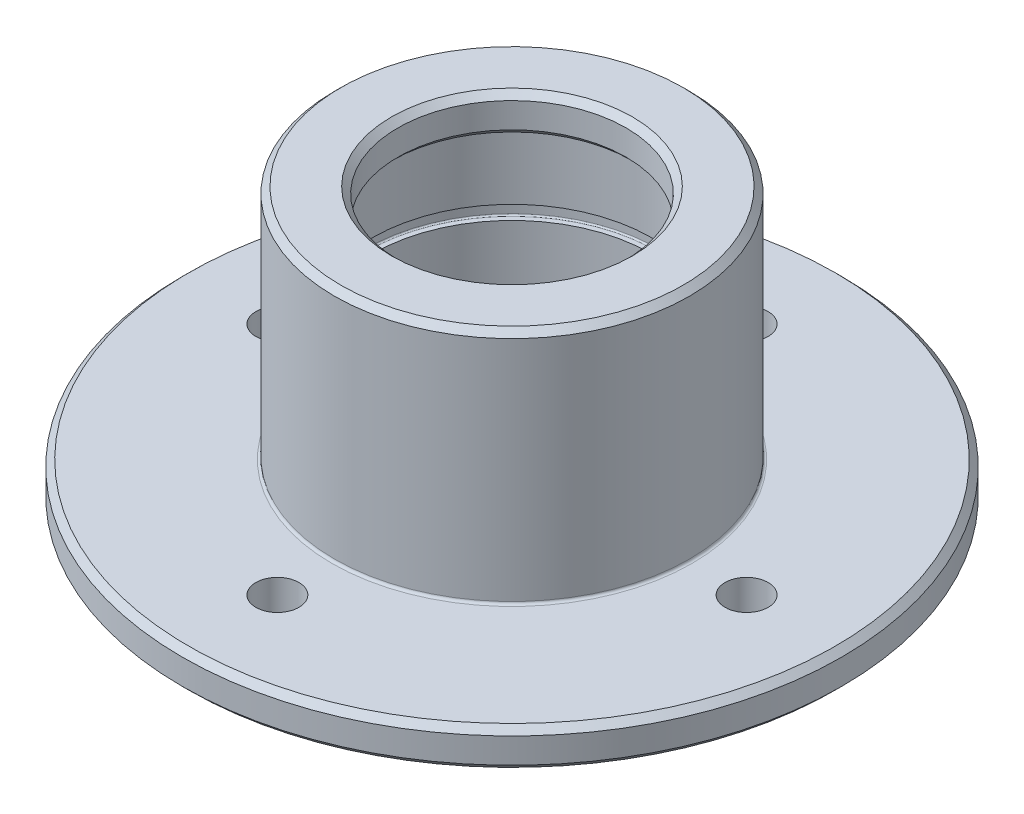
ISO-10303-21;
HEADER;
FILE_DESCRIPTION(('STEP AP214'),'2;1');
FILE_NAME('part.step','',(''),(''),'','','');
FILE_SCHEMA(('AUTOMOTIVE_DESIGN { 1 0 10303 214 1 1 1 1 }'));
ENDSEC;
DATA;
#1=APPLICATION_CONTEXT('core data for automotive mechanical design processes');
#2=APPLICATION_PROTOCOL_DEFINITION('international standard','automotive_design',2000,#1);
#3=PRODUCT_CONTEXT('',#1,'mechanical');
#4=PRODUCT('Part','Part','',(#3));
#5=PRODUCT_RELATED_PRODUCT_CATEGORY('part','',(#4));
#6=PRODUCT_DEFINITION_FORMATION('','',#4);
#7=PRODUCT_DEFINITION_CONTEXT('part definition',#1,'design');
#8=PRODUCT_DEFINITION('design','',#6,#7);
#9=PRODUCT_DEFINITION_SHAPE('','',#8);
#10=(LENGTH_UNIT() NAMED_UNIT(*) SI_UNIT(.MILLI.,.METRE.));
#11=(NAMED_UNIT(*) PLANE_ANGLE_UNIT() SI_UNIT($,.RADIAN.));
#12=(NAMED_UNIT(*) SI_UNIT($,.STERADIAN.) SOLID_ANGLE_UNIT());
#13=UNCERTAINTY_MEASURE_WITH_UNIT(LENGTH_MEASURE(1.E-05),#10,'distance_accuracy_value','');
#14=(GEOMETRIC_REPRESENTATION_CONTEXT(3) GLOBAL_UNCERTAINTY_ASSIGNED_CONTEXT((#13)) GLOBAL_UNIT_ASSIGNED_CONTEXT((#10,
#11,#12)) REPRESENTATION_CONTEXT('',''));
#15=CARTESIAN_POINT('',(0.,0.,0.));
#16=DIRECTION('',(0.,0.,1.));
#17=DIRECTION('',(1.,0.,0.));
#18=AXIS2_PLACEMENT_3D('',#15,#16,#17);
#19=CARTESIAN_POINT('',(0.,17.9540192467724,0.));
#20=DIRECTION('',(0.,1.,0.));
#21=DIRECTION('',(0.,0.,1.));
#22=AXIS2_PLACEMENT_3D('',#19,#20,#21);
#23=CYLINDRICAL_SURFACE('',#22,11.);
#24=CARTESIAN_POINT('',(0.,-2.5,0.));
#25=DIRECTION('',(0.,1.,0.));
#26=DIRECTION('',(0.,0.,1.));
#27=AXIS2_PLACEMENT_3D('',#24,#25,#26);
#28=CIRCLE('',#27,11.);
#29=CARTESIAN_POINT('',(0.,-2.5,11.));
#30=VERTEX_POINT('',#29);
#31=EDGE_CURVE('E68',#30,#30,#28,.F.);
#32=ORIENTED_EDGE('',*,*,#31,.T.);
#33=EDGE_LOOP('',(#32));
#34=FACE_BOUND('',#33,.T.);
#35=CARTESIAN_POINT('',(0.,8.55000000000001,0.));
#36=DIRECTION('',(0.,1.,0.));
#37=DIRECTION('',(0.,0.,1.));
#38=AXIS2_PLACEMENT_3D('',#35,#36,#37);
#39=CIRCLE('',#38,11.);
#40=CARTESIAN_POINT('',(0.,8.55000000000003,11.));
#41=VERTEX_POINT('',#40);
#42=EDGE_CURVE('E89',#41,#41,#39,.F.);
#43=ORIENTED_EDGE('',*,*,#42,.F.);
#44=EDGE_LOOP('',(#43));
#45=FACE_BOUND('',#44,.T.);
#46=ADVANCED_FACE('F33',(#34,#45),#23,.F.);
#47=CARTESIAN_POINT('',(0.,15.45,0.));
#48=DIRECTION('',(0.,1.,0.));
#49=DIRECTION('',(0.,0.,1.));
#50=AXIS2_PLACEMENT_3D('',#47,#48,#49);
#51=CIRCLE('',#50,11.);
#52=CARTESIAN_POINT('',(0.,15.45,11.));
#53=VERTEX_POINT('',#52);
#54=EDGE_CURVE('E86',#53,#53,#51,.T.);
#55=ORIENTED_EDGE('',*,*,#54,.T.);
#56=EDGE_LOOP('',(#55));
#57=FACE_BOUND('',#56,.T.);
#58=CARTESIAN_POINT('',(0.,9.65,0.));
#59=DIRECTION('',(0.,-1.,0.));
#60=DIRECTION('',(0.,0.,-1.));
#61=AXIS2_PLACEMENT_3D('',#58,#59,#60);
#62=CIRCLE('',#61,11.);
#63=CARTESIAN_POINT('',(0.,9.64999999999998,-11.));
#64=VERTEX_POINT('',#63);
#65=EDGE_CURVE('E92',#64,#64,#62,.F.);
#66=ORIENTED_EDGE('',*,*,#65,.F.);
#67=EDGE_LOOP('',(#66));
#68=FACE_BOUND('',#67,.T.);
#69=ADVANCED_FACE('F165',(#57,#68),#23,.F.);
#70=CARTESIAN_POINT('',(0.,17.9540192467724,0.));
#71=DIRECTION('',(0.,1.,0.));
#72=DIRECTION('',(0.,0.,1.));
#73=AXIS2_PLACEMENT_3D('',#70,#71,#72);
#74=CYLINDRICAL_SURFACE('',#73,9.);
#75=CARTESIAN_POINT('',(0.,18.15,0.));
#76=DIRECTION('',(0.,-1.,0.));
#77=DIRECTION('',(0.,0.,-1.));
#78=AXIS2_PLACEMENT_3D('',#75,#76,#77);
#79=CIRCLE('',#78,9.);
#80=CARTESIAN_POINT('',(0.,18.15,-9.));
#81=VERTEX_POINT('',#80);
#82=EDGE_CURVE('E53',#81,#81,#79,.F.);
#83=ORIENTED_EDGE('',*,*,#82,.T.);
#84=EDGE_LOOP('',(#83));
#85=FACE_BOUND('',#84,.T.);
#86=CARTESIAN_POINT('',(0.,16.15,0.));
#87=DIRECTION('',(0.,1.,0.));
#88=DIRECTION('',(0.,0.,1.));
#89=AXIS2_PLACEMENT_3D('',#86,#87,#88);
#90=CIRCLE('',#89,9.);
#91=CARTESIAN_POINT('',(0.,16.15,9.));
#92=VERTEX_POINT('',#91);
#93=EDGE_CURVE('E56',#92,#92,#90,.F.);
#94=ORIENTED_EDGE('',*,*,#93,.T.);
#95=EDGE_LOOP('',(#94));
#96=FACE_BOUND('',#95,.T.);
#97=ADVANCED_FACE('F171',(#85,#96),#74,.F.);
#98=CARTESIAN_POINT('',(9.,15.65,0.));
#99=DIRECTION('',(0.,1.,0.));
#100=DIRECTION('',(0.,0.,1.));
#101=AXIS2_PLACEMENT_3D('',#98,#99,#100);
#102=PLANE('',#101);
#103=CARTESIAN_POINT('',(0.,15.65,0.));
#104=DIRECTION('',(0.,1.,0.));
#105=DIRECTION('',(0.,0.,1.));
#106=AXIS2_PLACEMENT_3D('',#103,#104,#105);
#107=CIRCLE('',#106,9.49999999999999);
#108=CARTESIAN_POINT('',(0.,15.65,9.49999999999999));
#109=VERTEX_POINT('',#108);
#110=EDGE_CURVE('E48',#109,#109,#107,.T.);
#111=ORIENTED_EDGE('',*,*,#110,.T.);
#112=EDGE_LOOP('',(#111));
#113=FACE_BOUND('',#112,.T.);
#114=CARTESIAN_POINT('',(0.,15.65,0.));
#115=DIRECTION('',(0.,1.,0.));
#116=DIRECTION('',(0.,0.,1.));
#117=AXIS2_PLACEMENT_3D('',#114,#115,#116);
#118=CIRCLE('',#117,10.8);
#119=CARTESIAN_POINT('',(0.,15.65,10.8));
#120=VERTEX_POINT('',#119);
#121=EDGE_CURVE('E83',#120,#120,#118,.F.);
#122=ORIENTED_EDGE('',*,*,#121,.T.);
#123=EDGE_LOOP('',(#122));
#124=FACE_BOUND('',#123,.T.);
#125=ADVANCED_FACE('F178',(#113,#124),#102,.F.);
#126=CARTESIAN_POINT('',(26.,-3.,0.));
#127=DIRECTION('',(0.,1.,0.));
#128=DIRECTION('',(0.,0.,1.));
#129=AXIS2_PLACEMENT_3D('',#126,#127,#128);
#130=PLANE('',#129);
#131=CARTESIAN_POINT('',(0.,-3.,0.));
#132=DIRECTION('',(0.,1.,0.));
#133=DIRECTION('',(0.,0.,1.));
#134=AXIS2_PLACEMENT_3D('',#131,#132,#133);
#135=CIRCLE('',#134,11.5);
#136=CARTESIAN_POINT('',(0.,-3.,11.5));
#137=VERTEX_POINT('',#136);
#138=EDGE_CURVE('E71',#137,#137,#135,.T.);
#139=ORIENTED_EDGE('',*,*,#138,.T.);
#140=EDGE_LOOP('',(#139));
#141=FACE_BOUND('',#140,.T.);
#142=CARTESIAN_POINT('',(0.,-3.,0.));
#143=DIRECTION('',(0.,1.,0.));
#144=DIRECTION('',(0.,0.,1.));
#145=AXIS2_PLACEMENT_3D('',#142,#143,#144);
#146=CIRCLE('',#145,25.5);
#147=CARTESIAN_POINT('',(0.,-3.,25.5));
#148=VERTEX_POINT('',#147);
#149=EDGE_CURVE('E74',#148,#148,#146,.F.);
#150=ORIENTED_EDGE('',*,*,#149,.T.);
#151=EDGE_LOOP('',(#150));
#152=FACE_BOUND('',#151,.T.);
#153=CARTESIAN_POINT('',(0.,-3.,-18.5));
#154=DIRECTION('',(0.,1.,0.));
#155=DIRECTION('',(0.,0.,1.));
#156=AXIS2_PLACEMENT_3D('',#153,#154,#155);
#157=CIRCLE('',#156,1.7);
#158=CARTESIAN_POINT('',(0.,-3.,-16.8));
#159=VERTEX_POINT('',#158);
#160=EDGE_CURVE('E125',#159,#159,#157,.T.);
#161=ORIENTED_EDGE('',*,*,#160,.T.);
#162=EDGE_LOOP('',(#161));
#163=FACE_BOUND('',#162,.T.);
#164=CARTESIAN_POINT('',(18.5,-3.,0.));
#165=DIRECTION('',(0.,1.,0.));
#166=DIRECTION('',(0.,0.,1.));
#167=AXIS2_PLACEMENT_3D('',#164,#165,#166);
#168=CIRCLE('',#167,1.7);
#169=CARTESIAN_POINT('',(18.5,-3.,1.7));
#170=VERTEX_POINT('',#169);
#171=EDGE_CURVE('E119',#170,#170,#168,.T.);
#172=ORIENTED_EDGE('',*,*,#171,.T.);
#173=EDGE_LOOP('',(#172));
#174=FACE_BOUND('',#173,.T.);
#175=CARTESIAN_POINT('',(0.,-3.,18.5));
#176=DIRECTION('',(0.,1.,0.));
#177=DIRECTION('',(0.,0.,1.));
#178=AXIS2_PLACEMENT_3D('',#175,#176,#177);
#179=CIRCLE('',#178,1.7);
#180=CARTESIAN_POINT('',(0.,-3.,20.2));
#181=VERTEX_POINT('',#180);
#182=EDGE_CURVE('E113',#181,#181,#179,.T.);
#183=ORIENTED_EDGE('',*,*,#182,.T.);
#184=EDGE_LOOP('',(#183));
#185=FACE_BOUND('',#184,.T.);
#186=CARTESIAN_POINT('',(-18.5,-3.,0.));
#187=DIRECTION('',(0.,1.,0.));
#188=DIRECTION('',(0.,0.,1.));
#189=AXIS2_PLACEMENT_3D('',#186,#187,#188);
#190=CIRCLE('',#189,1.7);
#191=CARTESIAN_POINT('',(-18.5,-3.,1.7));
#192=VERTEX_POINT('',#191);
#193=EDGE_CURVE('E107',#192,#192,#190,.T.);
#194=ORIENTED_EDGE('',*,*,#193,.T.);
#195=EDGE_LOOP('',(#194));
#196=FACE_BOUND('',#195,.T.);
#197=ADVANCED_FACE('F176',(#141,#152,#163,#174,#185,#196),#130,.F.);
#198=CARTESIAN_POINT('',(0.,17.9540192467724,0.));
#199=DIRECTION('',(0.,1.,0.));
#200=DIRECTION('',(0.,0.,1.));
#201=AXIS2_PLACEMENT_3D('',#198,#199,#200);
#202=CYLINDRICAL_SURFACE('',#201,26.);
#203=CARTESIAN_POINT('',(0.,-2.50000000000001,0.));
#204=DIRECTION('',(0.,1.,0.));
#205=DIRECTION('',(0.,0.,1.));
#206=AXIS2_PLACEMENT_3D('',#203,#204,#205);
#207=CIRCLE('',#206,26.);
#208=CARTESIAN_POINT('',(0.,-2.50000000000001,26.));
#209=VERTEX_POINT('',#208);
#210=EDGE_CURVE('E40',#209,#209,#207,.T.);
#211=ORIENTED_EDGE('',*,*,#210,.T.);
#212=EDGE_LOOP('',(#211));
#213=FACE_BOUND('',#212,.T.);
#214=CARTESIAN_POINT('',(0.,-0.500000000000011,0.));
#215=DIRECTION('',(0.,-1.,0.));
#216=DIRECTION('',(0.,0.,-1.));
#217=AXIS2_PLACEMENT_3D('',#214,#215,#216);
#218=CIRCLE('',#217,26.);
#219=CARTESIAN_POINT('',(0.,-0.500000000000011,-26.));
#220=VERTEX_POINT('',#219);
#221=EDGE_CURVE('E44',#220,#220,#218,.T.);
#222=ORIENTED_EDGE('',*,*,#221,.T.);
#223=EDGE_LOOP('',(#222));
#224=FACE_BOUND('',#223,.T.);
#225=ADVANCED_FACE('F138',(#213,#224),#202,.T.);
#226=CARTESIAN_POINT('',(14.,0.,0.));
#227=DIRECTION('',(0.,-1.,0.));
#228=DIRECTION('',(0.,0.,-1.));
#229=AXIS2_PLACEMENT_3D('',#226,#227,#228);
#230=PLANE('',#229);
#231=CARTESIAN_POINT('',(0.,0.,0.));
#232=DIRECTION('',(0.,-1.,0.));
#233=DIRECTION('',(0.,0.,-1.));
#234=AXIS2_PLACEMENT_3D('',#231,#232,#233);
#235=CIRCLE('',#234,25.5);
#236=CARTESIAN_POINT('',(0.,0.,-25.5));
#237=VERTEX_POINT('',#236);
#238=EDGE_CURVE('E10',#237,#237,#235,.F.);
#239=ORIENTED_EDGE('',*,*,#238,.T.);
#240=EDGE_LOOP('',(#239));
#241=FACE_BOUND('',#240,.T.);
#242=CARTESIAN_POINT('',(0.,0.,0.));
#243=DIRECTION('',(0.,-1.,0.));
#244=DIRECTION('',(0.,0.,-1.));
#245=AXIS2_PLACEMENT_3D('',#242,#243,#244);
#246=CIRCLE('',#245,14.2);
#247=CARTESIAN_POINT('',(0.,0.,-14.2));
#248=VERTEX_POINT('',#247);
#249=EDGE_CURVE('E77',#248,#248,#246,.T.);
#250=ORIENTED_EDGE('',*,*,#249,.T.);
#251=EDGE_LOOP('',(#250));
#252=FACE_BOUND('',#251,.T.);
#253=CARTESIAN_POINT('',(0.,0.,-18.5));
#254=DIRECTION('',(0.,1.,0.));
#255=DIRECTION('',(0.,0.,1.));
#256=AXIS2_PLACEMENT_3D('',#253,#254,#255);
#257=CIRCLE('',#256,1.7);
#258=CARTESIAN_POINT('',(0.,0.,-16.8));
#259=VERTEX_POINT('',#258);
#260=EDGE_CURVE('E128',#259,#259,#257,.T.);
#261=ORIENTED_EDGE('',*,*,#260,.F.);
#262=EDGE_LOOP('',(#261));
#263=FACE_BOUND('',#262,.T.);
#264=CARTESIAN_POINT('',(18.5,0.,0.));
#265=DIRECTION('',(0.,1.,0.));
#266=DIRECTION('',(0.,0.,1.));
#267=AXIS2_PLACEMENT_3D('',#264,#265,#266);
#268=CIRCLE('',#267,1.7);
#269=CARTESIAN_POINT('',(18.5,0.,1.7));
#270=VERTEX_POINT('',#269);
#271=EDGE_CURVE('E122',#270,#270,#268,.T.);
#272=ORIENTED_EDGE('',*,*,#271,.F.);
#273=EDGE_LOOP('',(#272));
#274=FACE_BOUND('',#273,.T.);
#275=CARTESIAN_POINT('',(0.,0.,18.5));
#276=DIRECTION('',(0.,1.,0.));
#277=DIRECTION('',(0.,0.,1.));
#278=AXIS2_PLACEMENT_3D('',#275,#276,#277);
#279=CIRCLE('',#278,1.7);
#280=CARTESIAN_POINT('',(0.,0.,20.2));
#281=VERTEX_POINT('',#280);
#282=EDGE_CURVE('E116',#281,#281,#279,.T.);
#283=ORIENTED_EDGE('',*,*,#282,.F.);
#284=EDGE_LOOP('',(#283));
#285=FACE_BOUND('',#284,.T.);
#286=CARTESIAN_POINT('',(-18.5,0.,0.));
#287=DIRECTION('',(0.,1.,0.));
#288=DIRECTION('',(0.,0.,1.));
#289=AXIS2_PLACEMENT_3D('',#286,#287,#288);
#290=CIRCLE('',#289,1.7);
#291=CARTESIAN_POINT('',(-18.5,0.,1.7));
#292=VERTEX_POINT('',#291);
#293=EDGE_CURVE('E110',#292,#292,#290,.T.);
#294=ORIENTED_EDGE('',*,*,#293,.F.);
#295=EDGE_LOOP('',(#294));
#296=FACE_BOUND('',#295,.T.);
#297=ADVANCED_FACE('F134',(#241,#252,#263,#274,#285,#296),#230,.F.);
#298=CARTESIAN_POINT('',(0.,17.9540192467724,0.));
#299=DIRECTION('',(0.,1.,0.));
#300=DIRECTION('',(0.,0.,1.));
#301=AXIS2_PLACEMENT_3D('',#298,#299,#300);
#302=CYLINDRICAL_SURFACE('',#301,14.);
#303=CARTESIAN_POINT('',(0.,18.15,0.));
#304=DIRECTION('',(0.,-1.,0.));
#305=DIRECTION('',(0.,0.,-1.));
#306=AXIS2_PLACEMENT_3D('',#303,#304,#305);
#307=CIRCLE('',#306,14.);
#308=CARTESIAN_POINT('',(0.,18.15,-14.));
#309=VERTEX_POINT('',#308);
#310=EDGE_CURVE('E59',#309,#309,#307,.T.);
#311=ORIENTED_EDGE('',*,*,#310,.T.);
#312=EDGE_LOOP('',(#311));
#313=FACE_BOUND('',#312,.T.);
#314=CARTESIAN_POINT('',(0.,0.199999999999999,0.));
#315=DIRECTION('',(0.,-1.,0.));
#316=DIRECTION('',(0.,0.,-1.));
#317=AXIS2_PLACEMENT_3D('',#314,#315,#316);
#318=CIRCLE('',#317,14.);
#319=CARTESIAN_POINT('',(0.,0.199999999999999,-14.));
#320=VERTEX_POINT('',#319);
#321=EDGE_CURVE('E80',#320,#320,#318,.F.);
#322=ORIENTED_EDGE('',*,*,#321,.T.);
#323=EDGE_LOOP('',(#322));
#324=FACE_BOUND('',#323,.T.);
#325=ADVANCED_FACE('F137',(#313,#324),#302,.T.);
#326=CARTESIAN_POINT('',(14.,18.65,0.));
#327=DIRECTION('',(0.,-1.,0.));
#328=DIRECTION('',(0.,0.,-1.));
#329=AXIS2_PLACEMENT_3D('',#326,#327,#328);
#330=PLANE('',#329);
#331=CARTESIAN_POINT('',(0.,18.65,0.));
#332=DIRECTION('',(0.,-1.,0.));
#333=DIRECTION('',(0.,0.,-1.));
#334=AXIS2_PLACEMENT_3D('',#331,#332,#333);
#335=CIRCLE('',#334,13.5);
#336=CARTESIAN_POINT('',(0.,18.65,-13.5));
#337=VERTEX_POINT('',#336);
#338=EDGE_CURVE('E62',#337,#337,#335,.F.);
#339=ORIENTED_EDGE('',*,*,#338,.T.);
#340=EDGE_LOOP('',(#339));
#341=FACE_BOUND('',#340,.T.);
#342=CARTESIAN_POINT('',(0.,18.65,0.));
#343=DIRECTION('',(0.,-1.,0.));
#344=DIRECTION('',(0.,0.,-1.));
#345=AXIS2_PLACEMENT_3D('',#342,#343,#344);
#346=CIRCLE('',#345,9.49999999999998);
#347=CARTESIAN_POINT('',(0.,18.65,-9.49999999999998));
#348=VERTEX_POINT('',#347);
#349=EDGE_CURVE('E65',#348,#348,#346,.T.);
#350=ORIENTED_EDGE('',*,*,#349,.T.);
#351=EDGE_LOOP('',(#350));
#352=FACE_BOUND('',#351,.T.);
#353=ADVANCED_FACE('F341',(#341,#352),#330,.F.);
#354=CARTESIAN_POINT('',(0.,8.55000000000003,11.39));
#355=DIRECTION('',(0.,1.,0.));
#356=DIRECTION('',(0.,0.,1.));
#357=AXIS2_PLACEMENT_3D('',#354,#355,#356);
#358=PLANE('',#357);
#359=CARTESIAN_POINT('',(0.,8.55,0.));
#360=DIRECTION('',(0.,1.,0.));
#361=DIRECTION('',(0.,0.,1.));
#362=AXIS2_PLACEMENT_3D('',#359,#360,#361);
#363=CIRCLE('',#362,11.39);
#364=CARTESIAN_POINT('',(0.,8.55000000000002,11.39));
#365=VERTEX_POINT('',#364);
#366=EDGE_CURVE('E95',#365,#365,#363,.T.);
#367=ORIENTED_EDGE('',*,*,#366,.T.);
#368=EDGE_LOOP('',(#367));
#369=FACE_BOUND('',#368,.T.);
#370=ORIENTED_EDGE('',*,*,#42,.T.);
#371=EDGE_LOOP('',(#370));
#372=FACE_BOUND('',#371,.T.);
#373=ADVANCED_FACE('F333',(#369,#372),#358,.T.);
#374=CARTESIAN_POINT('',(0.,9.65000000000001,9.9));
#375=DIRECTION('',(0.,-1.,0.));
#376=DIRECTION('',(0.,0.,-1.));
#377=AXIS2_PLACEMENT_3D('',#374,#375,#376);
#378=PLANE('',#377);
#379=CARTESIAN_POINT('',(0.,9.64999999999999,0.));
#380=DIRECTION('',(0.,1.,0.));
#381=DIRECTION('',(0.,0.,1.));
#382=AXIS2_PLACEMENT_3D('',#379,#380,#381);
#383=CIRCLE('',#382,11.39);
#384=CARTESIAN_POINT('',(0.,9.65000000000001,11.39));
#385=VERTEX_POINT('',#384);
#386=EDGE_CURVE('E104',#385,#385,#383,.T.);
#387=ORIENTED_EDGE('',*,*,#386,.F.);
#388=EDGE_LOOP('',(#387));
#389=FACE_BOUND('',#388,.T.);
#390=ORIENTED_EDGE('',*,*,#65,.T.);
#391=EDGE_LOOP('',(#390));
#392=FACE_BOUND('',#391,.T.);
#393=ADVANCED_FACE('F324',(#389,#392),#378,.T.);
#394=CARTESIAN_POINT('',(0.,8.66000000000001,0.));
#395=DIRECTION('',(0.,1.,0.));
#396=DIRECTION('',(0.,0.,1.));
#397=AXIS2_PLACEMENT_3D('',#394,#395,#396);
#398=TOROIDAL_SURFACE('',#397,11.39,0.110000000000001);
#399=CARTESIAN_POINT('',(0.,8.66000000000001,0.));
#400=DIRECTION('',(0.,1.,0.));
#401=DIRECTION('',(0.,0.,1.));
#402=AXIS2_PLACEMENT_3D('',#399,#400,#401);
#403=CIRCLE('',#402,11.5);
#404=CARTESIAN_POINT('',(0.,8.66000000000003,11.5));
#405=VERTEX_POINT('',#404);
#406=EDGE_CURVE('E98',#405,#405,#403,.T.);
#407=ORIENTED_EDGE('',*,*,#406,.T.);
#408=EDGE_LOOP('',(#407));
#409=FACE_BOUND('',#408,.T.);
#410=ORIENTED_EDGE('',*,*,#366,.F.);
#411=EDGE_LOOP('',(#410));
#412=FACE_BOUND('',#411,.T.);
#413=ADVANCED_FACE('F315',(#409,#412),#398,.F.);
#414=CARTESIAN_POINT('',(0.,-32.0459807532277,0.));
#415=DIRECTION('',(0.,1.,0.));
#416=DIRECTION('',(0.,0.,1.));
#417=AXIS2_PLACEMENT_3D('',#414,#415,#416);
#418=CYLINDRICAL_SURFACE('',#417,11.5);
#419=CARTESIAN_POINT('',(0.,9.53999999999999,0.));
#420=DIRECTION('',(0.,1.,0.));
#421=DIRECTION('',(0.,0.,1.));
#422=AXIS2_PLACEMENT_3D('',#419,#420,#421);
#423=CIRCLE('',#422,11.5);
#424=CARTESIAN_POINT('',(0.,9.54000000000001,11.5));
#425=VERTEX_POINT('',#424);
#426=EDGE_CURVE('E101',#425,#425,#423,.T.);
#427=ORIENTED_EDGE('',*,*,#426,.T.);
#428=EDGE_LOOP('',(#427));
#429=FACE_BOUND('',#428,.T.);
#430=ORIENTED_EDGE('',*,*,#406,.F.);
#431=EDGE_LOOP('',(#430));
#432=FACE_BOUND('',#431,.T.);
#433=ADVANCED_FACE('F159',(#429,#432),#418,.F.);
#434=CARTESIAN_POINT('',(0.,9.54,0.));
#435=DIRECTION('',(0.,1.,0.));
#436=DIRECTION('',(0.,0.,1.));
#437=AXIS2_PLACEMENT_3D('',#434,#435,#436);
#438=TOROIDAL_SURFACE('',#437,11.39,0.11);
#439=ORIENTED_EDGE('',*,*,#386,.T.);
#440=EDGE_LOOP('',(#439));
#441=FACE_BOUND('',#440,.T.);
#442=ORIENTED_EDGE('',*,*,#426,.F.);
#443=EDGE_LOOP('',(#442));
#444=FACE_BOUND('',#443,.T.);
#445=ADVANCED_FACE('F149',(#441,#444),#438,.F.);
#446=CARTESIAN_POINT('',(-18.5,0.,0.));
#447=DIRECTION('',(0.,1.,0.));
#448=DIRECTION('',(0.,0.,1.));
#449=AXIS2_PLACEMENT_3D('',#446,#447,#448);
#450=CYLINDRICAL_SURFACE('',#449,1.7);
#451=ORIENTED_EDGE('',*,*,#193,.F.);
#452=EDGE_LOOP('',(#451));
#453=FACE_BOUND('',#452,.T.);
#454=ORIENTED_EDGE('',*,*,#293,.T.);
#455=EDGE_LOOP('',(#454));
#456=FACE_BOUND('',#455,.T.);
#457=ADVANCED_FACE('F146',(#453,#456),#450,.F.);
#458=CARTESIAN_POINT('',(0.,0.,18.5));
#459=DIRECTION('',(0.,1.,0.));
#460=DIRECTION('',(0.,0.,1.));
#461=AXIS2_PLACEMENT_3D('',#458,#459,#460);
#462=CYLINDRICAL_SURFACE('',#461,1.7);
#463=ORIENTED_EDGE('',*,*,#182,.F.);
#464=EDGE_LOOP('',(#463));
#465=FACE_BOUND('',#464,.T.);
#466=ORIENTED_EDGE('',*,*,#282,.T.);
#467=EDGE_LOOP('',(#466));
#468=FACE_BOUND('',#467,.T.);
#469=ADVANCED_FACE('F148',(#465,#468),#462,.F.);
#470=CARTESIAN_POINT('',(18.5,0.,0.));
#471=DIRECTION('',(0.,1.,0.));
#472=DIRECTION('',(0.,0.,1.));
#473=AXIS2_PLACEMENT_3D('',#470,#471,#472);
#474=CYLINDRICAL_SURFACE('',#473,1.7);
#475=ORIENTED_EDGE('',*,*,#171,.F.);
#476=EDGE_LOOP('',(#475));
#477=FACE_BOUND('',#476,.T.);
#478=ORIENTED_EDGE('',*,*,#271,.T.);
#479=EDGE_LOOP('',(#478));
#480=FACE_BOUND('',#479,.T.);
#481=ADVANCED_FACE('F156',(#477,#480),#474,.F.);
#482=CARTESIAN_POINT('',(0.,0.,-18.5));
#483=DIRECTION('',(0.,1.,0.));
#484=DIRECTION('',(0.,0.,1.));
#485=AXIS2_PLACEMENT_3D('',#482,#483,#484);
#486=CYLINDRICAL_SURFACE('',#485,1.7);
#487=ORIENTED_EDGE('',*,*,#160,.F.);
#488=EDGE_LOOP('',(#487));
#489=FACE_BOUND('',#488,.T.);
#490=ORIENTED_EDGE('',*,*,#260,.T.);
#491=EDGE_LOOP('',(#490));
#492=FACE_BOUND('',#491,.T.);
#493=ADVANCED_FACE('F132',(#489,#492),#486,.F.);
#494=CARTESIAN_POINT('',(0.,15.45,0.));
#495=DIRECTION('',(0.,1.,0.));
#496=DIRECTION('',(0.,0.,1.));
#497=AXIS2_PLACEMENT_3D('',#494,#495,#496);
#498=TOROIDAL_SURFACE('',#497,10.8,0.2);
#499=ORIENTED_EDGE('',*,*,#121,.F.);
#500=EDGE_LOOP('',(#499));
#501=FACE_BOUND('',#500,.T.);
#502=ORIENTED_EDGE('',*,*,#54,.F.);
#503=EDGE_LOOP('',(#502));
#504=FACE_BOUND('',#503,.T.);
#505=ADVANCED_FACE('F185',(#501,#504),#498,.F.);
#506=CARTESIAN_POINT('',(0.,0.199999999999999,0.));
#507=DIRECTION('',(0.,-1.,0.));
#508=DIRECTION('',(0.,0.,-1.));
#509=AXIS2_PLACEMENT_3D('',#506,#507,#508);
#510=TOROIDAL_SURFACE('',#509,14.2,0.2);
#511=ORIENTED_EDGE('',*,*,#249,.F.);
#512=EDGE_LOOP('',(#511));
#513=FACE_BOUND('',#512,.T.);
#514=ORIENTED_EDGE('',*,*,#321,.F.);
#515=EDGE_LOOP('',(#514));
#516=FACE_BOUND('',#515,.T.);
#517=ADVANCED_FACE('F188',(#513,#516),#510,.F.);
#518=CARTESIAN_POINT('',(0.,-3.,0.));
#519=DIRECTION('',(0.,-1.,0.));
#520=DIRECTION('',(0.,0.,-1.));
#521=AXIS2_PLACEMENT_3D('',#518,#519,#520);
#522=CONICAL_SURFACE('',#521,11.5,0.785398163397447);
#523=ORIENTED_EDGE('',*,*,#31,.F.);
#524=EDGE_LOOP('',(#523));
#525=FACE_BOUND('',#524,.T.);
#526=ORIENTED_EDGE('',*,*,#138,.F.);
#527=EDGE_LOOP('',(#526));
#528=FACE_BOUND('',#527,.T.);
#529=ADVANCED_FACE('F192',(#525,#528),#522,.F.);
#530=CARTESIAN_POINT('',(0.,18.65,0.));
#531=DIRECTION('',(0.,-1.,0.));
#532=DIRECTION('',(0.,0.,-1.));
#533=AXIS2_PLACEMENT_3D('',#530,#531,#532);
#534=CONICAL_SURFACE('',#533,13.5,0.785398163397447);
#535=ORIENTED_EDGE('',*,*,#310,.F.);
#536=EDGE_LOOP('',(#535));
#537=FACE_BOUND('',#536,.T.);
#538=ORIENTED_EDGE('',*,*,#338,.F.);
#539=EDGE_LOOP('',(#538));
#540=FACE_BOUND('',#539,.T.);
#541=ADVANCED_FACE('F196',(#537,#540),#534,.T.);
#542=CARTESIAN_POINT('',(0.,18.15,0.));
#543=DIRECTION('',(0.,1.,0.));
#544=DIRECTION('',(0.,0.,1.));
#545=AXIS2_PLACEMENT_3D('',#542,#543,#544);
#546=CONICAL_SURFACE('',#545,9.,0.785398163397443);
#547=ORIENTED_EDGE('',*,*,#349,.F.);
#548=EDGE_LOOP('',(#547));
#549=FACE_BOUND('',#548,.T.);
#550=ORIENTED_EDGE('',*,*,#82,.F.);
#551=EDGE_LOOP('',(#550));
#552=FACE_BOUND('',#551,.T.);
#553=ADVANCED_FACE('F200',(#549,#552),#546,.F.);
#554=CARTESIAN_POINT('',(0.,15.65,0.));
#555=DIRECTION('',(0.,-1.,0.));
#556=DIRECTION('',(0.,0.,-1.));
#557=AXIS2_PLACEMENT_3D('',#554,#555,#556);
#558=CONICAL_SURFACE('',#557,9.49999999999999,0.785398163397443);
#559=ORIENTED_EDGE('',*,*,#93,.F.);
#560=EDGE_LOOP('',(#559));
#561=FACE_BOUND('',#560,.T.);
#562=ORIENTED_EDGE('',*,*,#110,.F.);
#563=EDGE_LOOP('',(#562));
#564=FACE_BOUND('',#563,.T.);
#565=ADVANCED_FACE('F204',(#561,#564),#558,.F.);
#566=CARTESIAN_POINT('',(0.,-2.50000000000001,0.));
#567=DIRECTION('',(0.,1.,0.));
#568=DIRECTION('',(0.,0.,1.));
#569=AXIS2_PLACEMENT_3D('',#566,#567,#568);
#570=CONICAL_SURFACE('',#569,26.,0.785398163397445);
#571=ORIENTED_EDGE('',*,*,#149,.F.);
#572=EDGE_LOOP('',(#571));
#573=FACE_BOUND('',#572,.T.);
#574=ORIENTED_EDGE('',*,*,#210,.F.);
#575=EDGE_LOOP('',(#574));
#576=FACE_BOUND('',#575,.T.);
#577=ADVANCED_FACE('F207',(#573,#576),#570,.T.);
#578=CARTESIAN_POINT('',(0.,0.,0.));
#579=DIRECTION('',(0.,-1.,0.));
#580=DIRECTION('',(0.,0.,-1.));
#581=AXIS2_PLACEMENT_3D('',#578,#579,#580);
#582=CONICAL_SURFACE('',#581,25.5,0.785398163397445);
#583=ORIENTED_EDGE('',*,*,#221,.F.);
#584=EDGE_LOOP('',(#583));
#585=FACE_BOUND('',#584,.T.);
#586=ORIENTED_EDGE('',*,*,#238,.F.);
#587=EDGE_LOOP('',(#586));
#588=FACE_BOUND('',#587,.T.);
#589=ADVANCED_FACE('F35',(#585,#588),#582,.T.);
#590=CLOSED_SHELL('',(#46,#69,#97,#125,#197,#225,#297,#325,#353,#373,#393,#413,#433,#445,#457,
#469,#481,#493,#505,#517,#529,#541,#553,#565,#577,#589));
#591=MANIFOLD_SOLID_BREP('B2',#590);
#592=ADVANCED_BREP_SHAPE_REPRESENTATION('',(#18,#591),#14);
#593=SHAPE_DEFINITION_REPRESENTATION(#9,#592);
ENDSEC;
END-ISO-10303-21;
